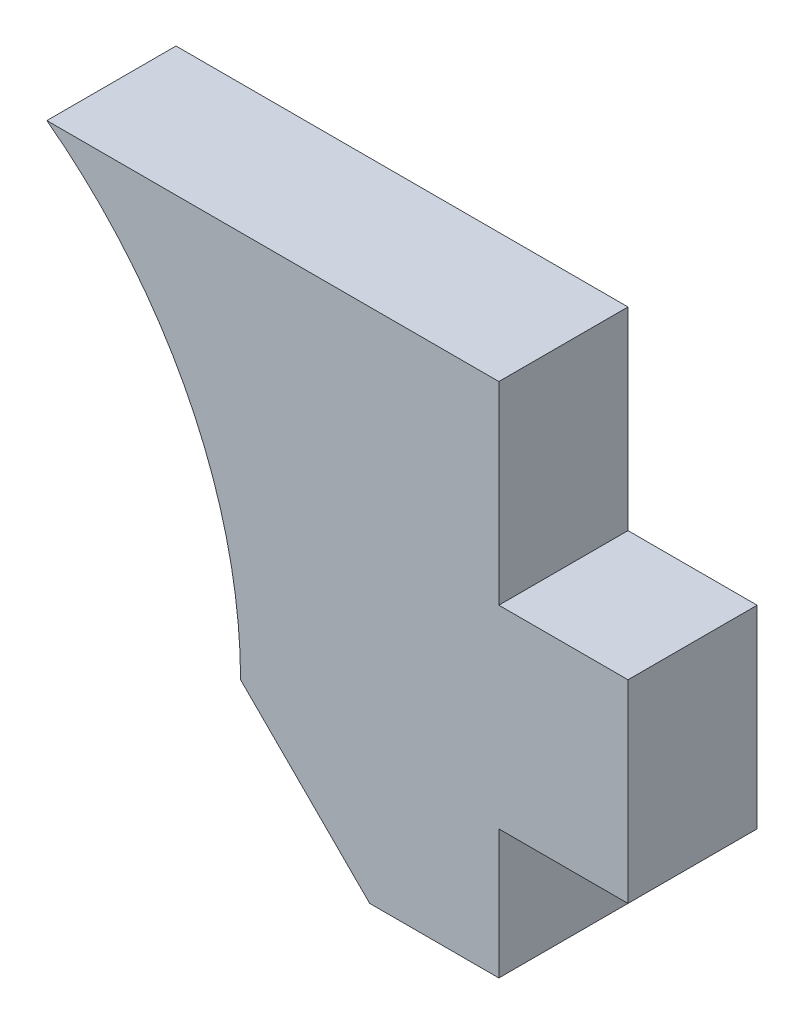
ISO-10303-21;
HEADER;
FILE_DESCRIPTION(('STEP AP214'),'2;1');
FILE_NAME('part.step','',(''),(''),'','','');
FILE_SCHEMA(('AUTOMOTIVE_DESIGN { 1 0 10303 214 1 1 1 1 }'));
ENDSEC;
DATA;
#1=APPLICATION_CONTEXT('core data for automotive mechanical design processes');
#2=APPLICATION_PROTOCOL_DEFINITION('international standard','automotive_design',2000,#1);
#3=PRODUCT_CONTEXT('',#1,'mechanical');
#4=PRODUCT('Part','Part','',(#3));
#5=PRODUCT_RELATED_PRODUCT_CATEGORY('part','',(#4));
#6=PRODUCT_DEFINITION_FORMATION('','',#4);
#7=PRODUCT_DEFINITION_CONTEXT('part definition',#1,'design');
#8=PRODUCT_DEFINITION('design','',#6,#7);
#9=PRODUCT_DEFINITION_SHAPE('','',#8);
#10=(LENGTH_UNIT() NAMED_UNIT(*) SI_UNIT(.MILLI.,.METRE.));
#11=(NAMED_UNIT(*) PLANE_ANGLE_UNIT() SI_UNIT($,.RADIAN.));
#12=(NAMED_UNIT(*) SI_UNIT($,.STERADIAN.) SOLID_ANGLE_UNIT());
#13=UNCERTAINTY_MEASURE_WITH_UNIT(LENGTH_MEASURE(1.E-05),#10,'distance_accuracy_value','');
#14=(GEOMETRIC_REPRESENTATION_CONTEXT(3) GLOBAL_UNCERTAINTY_ASSIGNED_CONTEXT((#13)) GLOBAL_UNIT_ASSIGNED_CONTEXT((#10,
#11,#12)) REPRESENTATION_CONTEXT('',''));
#15=CARTESIAN_POINT('',(0.,0.,0.));
#16=DIRECTION('',(0.,0.,1.));
#17=DIRECTION('',(1.,0.,0.));
#18=AXIS2_PLACEMENT_3D('',#15,#16,#17);
#19=CARTESIAN_POINT('',(493.924864813612,8.74955488540309,3.));
#20=DIRECTION('',(0.,1.,0.));
#21=DIRECTION('',(0.,0.,1.));
#22=AXIS2_PLACEMENT_3D('',#19,#20,#21);
#23=PLANE('',#22);
#24=DIRECTION('',(1.,0.,0.));
#25=VECTOR('',#24,1.);
#26=CARTESIAN_POINT('',(493.924864813612,8.74955488540309,0.));
#27=LINE('',#26,#25);
#28=CARTESIAN_POINT('',(490.924864813612,8.74955488540309,0.));
#29=VERTEX_POINT('',#28);
#30=CARTESIAN_POINT('',(493.924864813612,8.74955488540309,0.));
#31=VERTEX_POINT('',#30);
#32=EDGE_CURVE('E136',#29,#31,#27,.T.);
#33=ORIENTED_EDGE('',*,*,#32,.T.);
#34=DIRECTION('',(0.,0.,-1.));
#35=VECTOR('',#34,1.);
#36=CARTESIAN_POINT('',(493.924864813612,8.74955488540309,3.));
#37=LINE('',#36,#35);
#38=CARTESIAN_POINT('',(493.924864813612,8.74955488540309,3.));
#39=VERTEX_POINT('',#38);
#40=EDGE_CURVE('E11',#39,#31,#37,.T.);
#41=ORIENTED_EDGE('',*,*,#40,.F.);
#42=DIRECTION('',(1.,0.,0.));
#43=VECTOR('',#42,1.);
#44=CARTESIAN_POINT('',(493.924864813612,8.74955488540309,3.));
#45=LINE('',#44,#43);
#46=CARTESIAN_POINT('',(490.924864813612,8.74955488540309,3.));
#47=VERTEX_POINT('',#46);
#48=EDGE_CURVE('E152',#47,#39,#45,.T.);
#49=ORIENTED_EDGE('',*,*,#48,.F.);
#50=DIRECTION('',(0.,0.,-1.));
#51=VECTOR('',#50,1.);
#52=CARTESIAN_POINT('',(490.924864813612,8.74955488540309,3.));
#53=LINE('',#52,#51);
#54=EDGE_CURVE('E132',#47,#29,#53,.T.);
#55=ORIENTED_EDGE('',*,*,#54,.T.);
#56=EDGE_LOOP('',(#33,#41,#49,#55));
#57=FACE_BOUND('',#56,.T.);
#58=ADVANCED_FACE('F34',(#57),#23,.F.);
#59=CARTESIAN_POINT('',(493.924864813612,13.2495548854104,3.));
#60=DIRECTION('',(-1.,0.,0.));
#61=DIRECTION('',(0.,0.,1.));
#62=AXIS2_PLACEMENT_3D('',#59,#60,#61);
#63=PLANE('',#62);
#64=DIRECTION('',(0.,1.,0.));
#65=VECTOR('',#64,1.);
#66=CARTESIAN_POINT('',(493.924864813612,13.2495548854104,0.));
#67=LINE('',#66,#65);
#68=CARTESIAN_POINT('',(493.924864813612,13.2495548854104,0.));
#69=VERTEX_POINT('',#68);
#70=EDGE_CURVE('E139',#31,#69,#67,.T.);
#71=ORIENTED_EDGE('',*,*,#70,.T.);
#72=DIRECTION('',(0.,0.,-1.));
#73=VECTOR('',#72,1.);
#74=CARTESIAN_POINT('',(493.924864813612,13.2495548854104,3.));
#75=LINE('',#74,#73);
#76=CARTESIAN_POINT('',(493.924864813612,13.2495548854104,3.));
#77=VERTEX_POINT('',#76);
#78=EDGE_CURVE('E42',#77,#69,#75,.T.);
#79=ORIENTED_EDGE('',*,*,#78,.F.);
#80=DIRECTION('',(0.,1.,0.));
#81=VECTOR('',#80,1.);
#82=CARTESIAN_POINT('',(493.924864813612,13.2495548854104,3.));
#83=LINE('',#82,#81);
#84=EDGE_CURVE('E96',#39,#77,#83,.T.);
#85=ORIENTED_EDGE('',*,*,#84,.F.);
#86=ORIENTED_EDGE('',*,*,#40,.T.);
#87=EDGE_LOOP('',(#71,#79,#85,#86));
#88=FACE_BOUND('',#87,.T.);
#89=ADVANCED_FACE('F195',(#88),#63,.F.);
#90=CARTESIAN_POINT('',(490.924864813612,13.2495548854104,3.));
#91=DIRECTION('',(0.,-1.,0.));
#92=DIRECTION('',(0.,0.,-1.));
#93=AXIS2_PLACEMENT_3D('',#90,#91,#92);
#94=PLANE('',#93);
#95=DIRECTION('',(-1.,0.,0.));
#96=VECTOR('',#95,1.);
#97=CARTESIAN_POINT('',(490.924864813612,13.2495548854104,0.));
#98=LINE('',#97,#96);
#99=CARTESIAN_POINT('',(490.924864813612,13.2495548854104,0.));
#100=VERTEX_POINT('',#99);
#101=EDGE_CURVE('E141',#69,#100,#98,.T.);
#102=ORIENTED_EDGE('',*,*,#101,.T.);
#103=DIRECTION('',(0.,0.,-1.));
#104=VECTOR('',#103,1.);
#105=CARTESIAN_POINT('',(490.924864813612,13.2495548854104,3.));
#106=LINE('',#105,#104);
#107=CARTESIAN_POINT('',(490.924864813612,13.2495548854104,3.));
#108=VERTEX_POINT('',#107);
#109=EDGE_CURVE('E162',#108,#100,#106,.T.);
#110=ORIENTED_EDGE('',*,*,#109,.F.);
#111=DIRECTION('',(-1.,0.,0.));
#112=VECTOR('',#111,1.);
#113=CARTESIAN_POINT('',(490.924864813612,13.2495548854104,3.));
#114=LINE('',#113,#112);
#115=EDGE_CURVE('E170',#77,#108,#114,.T.);
#116=ORIENTED_EDGE('',*,*,#115,.F.);
#117=ORIENTED_EDGE('',*,*,#78,.T.);
#118=EDGE_LOOP('',(#102,#110,#116,#117));
#119=FACE_BOUND('',#118,.T.);
#120=ADVANCED_FACE('F168',(#119),#94,.F.);
#121=CARTESIAN_POINT('',(490.924864813612,17.7495548854058,3.));
#122=DIRECTION('',(-1.,0.,0.));
#123=DIRECTION('',(0.,0.,1.));
#124=AXIS2_PLACEMENT_3D('',#121,#122,#123);
#125=PLANE('',#124);
#126=DIRECTION('',(0.,1.,0.));
#127=VECTOR('',#126,1.);
#128=CARTESIAN_POINT('',(490.924864813612,17.7495548854058,0.));
#129=LINE('',#128,#127);
#130=CARTESIAN_POINT('',(490.924864813612,17.7495548854058,0.));
#131=VERTEX_POINT('',#130);
#132=EDGE_CURVE('E143',#100,#131,#129,.T.);
#133=ORIENTED_EDGE('',*,*,#132,.T.);
#134=DIRECTION('',(0.,0.,-1.));
#135=VECTOR('',#134,1.);
#136=CARTESIAN_POINT('',(490.924864813612,17.7495548854058,3.));
#137=LINE('',#136,#135);
#138=CARTESIAN_POINT('',(490.924864813612,17.7495548854058,3.));
#139=VERTEX_POINT('',#138);
#140=EDGE_CURVE('E159',#139,#131,#137,.T.);
#141=ORIENTED_EDGE('',*,*,#140,.F.);
#142=DIRECTION('',(0.,1.,0.));
#143=VECTOR('',#142,1.);
#144=CARTESIAN_POINT('',(490.924864813612,17.7495548854058,3.));
#145=LINE('',#144,#143);
#146=EDGE_CURVE('E186',#108,#139,#145,.T.);
#147=ORIENTED_EDGE('',*,*,#146,.F.);
#148=ORIENTED_EDGE('',*,*,#109,.T.);
#149=EDGE_LOOP('',(#133,#141,#147,#148));
#150=FACE_BOUND('',#149,.T.);
#151=ADVANCED_FACE('F179',(#150),#125,.F.);
#152=CARTESIAN_POINT('',(480.424864813604,17.7495548854095,3.));
#153=DIRECTION('',(-3.46283848156625E-13,-1.,0.));
#154=DIRECTION('',(1.,-3.46283848156625E-13,0.));
#155=AXIS2_PLACEMENT_3D('',#152,#153,#154);
#156=PLANE('',#155);
#157=DIRECTION('',(-1.,3.46283848156625E-13,0.));
#158=VECTOR('',#157,1.);
#159=CARTESIAN_POINT('',(480.424864813604,17.7495548854095,0.));
#160=LINE('',#159,#158);
#161=CARTESIAN_POINT('',(480.424864813604,17.7495548854094,0.));
#162=VERTEX_POINT('',#161);
#163=EDGE_CURVE('E145',#131,#162,#160,.T.);
#164=ORIENTED_EDGE('',*,*,#163,.T.);
#165=DIRECTION('',(0.,0.,-1.));
#166=VECTOR('',#165,1.);
#167=CARTESIAN_POINT('',(480.424864813604,17.7495548854094,3.));
#168=LINE('',#167,#166);
#169=CARTESIAN_POINT('',(480.424864813604,17.7495548854094,3.));
#170=VERTEX_POINT('',#169);
#171=EDGE_CURVE('E156',#170,#162,#168,.T.);
#172=ORIENTED_EDGE('',*,*,#171,.F.);
#173=DIRECTION('',(-1.,3.46283848156625E-13,0.));
#174=VECTOR('',#173,1.);
#175=CARTESIAN_POINT('',(480.424864813604,17.7495548854095,3.));
#176=LINE('',#175,#174);
#177=EDGE_CURVE('E185',#139,#170,#176,.T.);
#178=ORIENTED_EDGE('',*,*,#177,.F.);
#179=ORIENTED_EDGE('',*,*,#140,.T.);
#180=EDGE_LOOP('',(#164,#172,#178,#179));
#181=FACE_BOUND('',#180,.T.);
#182=ADVANCED_FACE('F183',(#181),#156,.F.);
#183=CARTESIAN_POINT('',(473.674864813611,8.7495548854032,3.));
#184=DIRECTION('',(0.,0.,-1.));
#185=DIRECTION('',(-1.,0.,0.));
#186=AXIS2_PLACEMENT_3D('',#183,#184,#185);
#187=CYLINDRICAL_SURFACE('',#186,11.2500000000003);
#188=CARTESIAN_POINT('',(473.674864813611,8.7495548854032,0.));
#189=DIRECTION('',(0.,0.,-1.));
#190=DIRECTION('',(1.,0.,0.));
#191=AXIS2_PLACEMENT_3D('',#188,#189,#190);
#192=CIRCLE('',#191,11.2500000000003);
#193=CARTESIAN_POINT('',(484.924864813612,8.74955488540309,0.));
#194=VERTEX_POINT('',#193);
#195=EDGE_CURVE('E147',#162,#194,#192,.T.);
#196=ORIENTED_EDGE('',*,*,#195,.T.);
#197=DIRECTION('',(0.,0.,-1.));
#198=VECTOR('',#197,1.);
#199=CARTESIAN_POINT('',(484.924864813612,8.74955488540309,3.));
#200=LINE('',#199,#198);
#201=CARTESIAN_POINT('',(484.924864813612,8.74955488540309,3.));
#202=VERTEX_POINT('',#201);
#203=EDGE_CURVE('E127',#202,#194,#200,.T.);
#204=ORIENTED_EDGE('',*,*,#203,.F.);
#205=CARTESIAN_POINT('',(473.674864813611,8.7495548854032,3.));
#206=DIRECTION('',(0.,0.,-1.));
#207=DIRECTION('',(1.,0.,0.));
#208=AXIS2_PLACEMENT_3D('',#205,#206,#207);
#209=CIRCLE('',#208,11.2500000000003);
#210=EDGE_CURVE('E118',#170,#202,#209,.T.);
#211=ORIENTED_EDGE('',*,*,#210,.F.);
#212=ORIENTED_EDGE('',*,*,#171,.T.);
#213=EDGE_LOOP('',(#196,#204,#211,#212));
#214=FACE_BOUND('',#213,.T.);
#215=ADVANCED_FACE('F207',(#214),#187,.F.);
#216=CARTESIAN_POINT('',(487.924864813612,5.74955488540309,3.));
#217=DIRECTION('',(0.707106781186547,0.707106781186548,0.));
#218=DIRECTION('',(-0.707106781186548,0.707106781186547,0.));
#219=AXIS2_PLACEMENT_3D('',#216,#217,#218);
#220=PLANE('',#219);
#221=DIRECTION('',(0.707106781186548,-0.707106781186547,0.));
#222=VECTOR('',#221,1.);
#223=CARTESIAN_POINT('',(487.924864813612,5.74955488540309,0.));
#224=LINE('',#223,#222);
#225=CARTESIAN_POINT('',(487.924864813612,5.74955488540309,0.));
#226=VERTEX_POINT('',#225);
#227=EDGE_CURVE('E126',#194,#226,#224,.T.);
#228=ORIENTED_EDGE('',*,*,#227,.T.);
#229=DIRECTION('',(0.,0.,-1.));
#230=VECTOR('',#229,1.);
#231=CARTESIAN_POINT('',(487.924864813612,5.74955488540309,3.));
#232=LINE('',#231,#230);
#233=CARTESIAN_POINT('',(487.924864813612,5.74955488540309,3.));
#234=VERTEX_POINT('',#233);
#235=EDGE_CURVE('E123',#234,#226,#232,.T.);
#236=ORIENTED_EDGE('',*,*,#235,.F.);
#237=DIRECTION('',(0.707106781186548,-0.707106781186547,0.));
#238=VECTOR('',#237,1.);
#239=CARTESIAN_POINT('',(487.924864813612,5.74955488540309,3.));
#240=LINE('',#239,#238);
#241=EDGE_CURVE('E112',#202,#234,#240,.T.);
#242=ORIENTED_EDGE('',*,*,#241,.F.);
#243=ORIENTED_EDGE('',*,*,#203,.T.);
#244=EDGE_LOOP('',(#228,#236,#242,#243));
#245=FACE_BOUND('',#244,.T.);
#246=ADVANCED_FACE('F124',(#245),#220,.F.);
#247=CARTESIAN_POINT('',(490.924864813612,5.74955488540309,3.));
#248=DIRECTION('',(0.,1.,0.));
#249=DIRECTION('',(0.,0.,1.));
#250=AXIS2_PLACEMENT_3D('',#247,#248,#249);
#251=PLANE('',#250);
#252=DIRECTION('',(1.,0.,0.));
#253=VECTOR('',#252,1.);
#254=CARTESIAN_POINT('',(490.924864813612,5.74955488540309,0.));
#255=LINE('',#254,#253);
#256=CARTESIAN_POINT('',(490.924864813612,5.74955488540309,0.));
#257=VERTEX_POINT('',#256);
#258=EDGE_CURVE('E82',#226,#257,#255,.T.);
#259=ORIENTED_EDGE('',*,*,#258,.T.);
#260=DIRECTION('',(0.,0.,-1.));
#261=VECTOR('',#260,1.);
#262=CARTESIAN_POINT('',(490.924864813612,5.74955488540309,3.));
#263=LINE('',#262,#261);
#264=CARTESIAN_POINT('',(490.924864813612,5.74955488540309,3.));
#265=VERTEX_POINT('',#264);
#266=EDGE_CURVE('E128',#265,#257,#263,.T.);
#267=ORIENTED_EDGE('',*,*,#266,.F.);
#268=DIRECTION('',(1.,0.,0.));
#269=VECTOR('',#268,1.);
#270=CARTESIAN_POINT('',(490.924864813612,5.74955488540309,3.));
#271=LINE('',#270,#269);
#272=EDGE_CURVE('E116',#234,#265,#271,.T.);
#273=ORIENTED_EDGE('',*,*,#272,.F.);
#274=ORIENTED_EDGE('',*,*,#235,.T.);
#275=EDGE_LOOP('',(#259,#267,#273,#274));
#276=FACE_BOUND('',#275,.T.);
#277=ADVANCED_FACE('F130',(#276),#251,.F.);
#278=CARTESIAN_POINT('',(490.924864813612,8.74955488540309,3.));
#279=DIRECTION('',(-1.,0.,0.));
#280=DIRECTION('',(0.,0.,1.));
#281=AXIS2_PLACEMENT_3D('',#278,#279,#280);
#282=PLANE('',#281);
#283=DIRECTION('',(0.,1.,0.));
#284=VECTOR('',#283,1.);
#285=CARTESIAN_POINT('',(490.924864813612,8.74955488540309,0.));
#286=LINE('',#285,#284);
#287=EDGE_CURVE('E88',#257,#29,#286,.T.);
#288=ORIENTED_EDGE('',*,*,#287,.T.);
#289=ORIENTED_EDGE('',*,*,#54,.F.);
#290=DIRECTION('',(0.,1.,0.));
#291=VECTOR('',#290,1.);
#292=CARTESIAN_POINT('',(490.924864813612,8.74955488540309,3.));
#293=LINE('',#292,#291);
#294=EDGE_CURVE('E50',#265,#47,#293,.T.);
#295=ORIENTED_EDGE('',*,*,#294,.F.);
#296=ORIENTED_EDGE('',*,*,#266,.T.);
#297=EDGE_LOOP('',(#288,#289,#295,#296));
#298=FACE_BOUND('',#297,.T.);
#299=ADVANCED_FACE('F215',(#298),#282,.F.);
#300=CARTESIAN_POINT('',(473.674864813611,8.7495548854032,3.));
#301=DIRECTION('',(0.,0.,1.));
#302=DIRECTION('',(1.,0.,0.));
#303=AXIS2_PLACEMENT_3D('',#300,#301,#302);
#304=PLANE('',#303);
#305=ORIENTED_EDGE('',*,*,#48,.T.);
#306=ORIENTED_EDGE('',*,*,#84,.T.);
#307=ORIENTED_EDGE('',*,*,#115,.T.);
#308=ORIENTED_EDGE('',*,*,#146,.T.);
#309=ORIENTED_EDGE('',*,*,#177,.T.);
#310=ORIENTED_EDGE('',*,*,#210,.T.);
#311=ORIENTED_EDGE('',*,*,#241,.T.);
#312=ORIENTED_EDGE('',*,*,#272,.T.);
#313=ORIENTED_EDGE('',*,*,#294,.T.);
#314=EDGE_LOOP('',(#305,#306,#307,#308,#309,#310,#311,#312,#313));
#315=FACE_BOUND('',#314,.T.);
#316=ADVANCED_FACE('F114',(#315),#304,.T.);
#317=CARTESIAN_POINT('',(473.674864813611,8.7495548854032,0.));
#318=DIRECTION('',(0.,0.,1.));
#319=DIRECTION('',(1.,0.,0.));
#320=AXIS2_PLACEMENT_3D('',#317,#318,#319);
#321=PLANE('',#320);
#322=ORIENTED_EDGE('',*,*,#32,.F.);
#323=ORIENTED_EDGE('',*,*,#287,.F.);
#324=ORIENTED_EDGE('',*,*,#258,.F.);
#325=ORIENTED_EDGE('',*,*,#227,.F.);
#326=ORIENTED_EDGE('',*,*,#195,.F.);
#327=ORIENTED_EDGE('',*,*,#163,.F.);
#328=ORIENTED_EDGE('',*,*,#132,.F.);
#329=ORIENTED_EDGE('',*,*,#101,.F.);
#330=ORIENTED_EDGE('',*,*,#70,.F.);
#331=EDGE_LOOP('',(#322,#323,#324,#325,#326,#327,#328,#329,#330));
#332=FACE_BOUND('',#331,.T.);
#333=ADVANCED_FACE('F174',(#332),#321,.F.);
#334=CLOSED_SHELL('',(#58,#89,#120,#151,#182,#215,#246,#277,#299,#316,#333));
#335=MANIFOLD_SOLID_BREP('B2',#334);
#336=ADVANCED_BREP_SHAPE_REPRESENTATION('',(#18,#335),#14);
#337=SHAPE_DEFINITION_REPRESENTATION(#9,#336);
ENDSEC;
END-ISO-10303-21;
